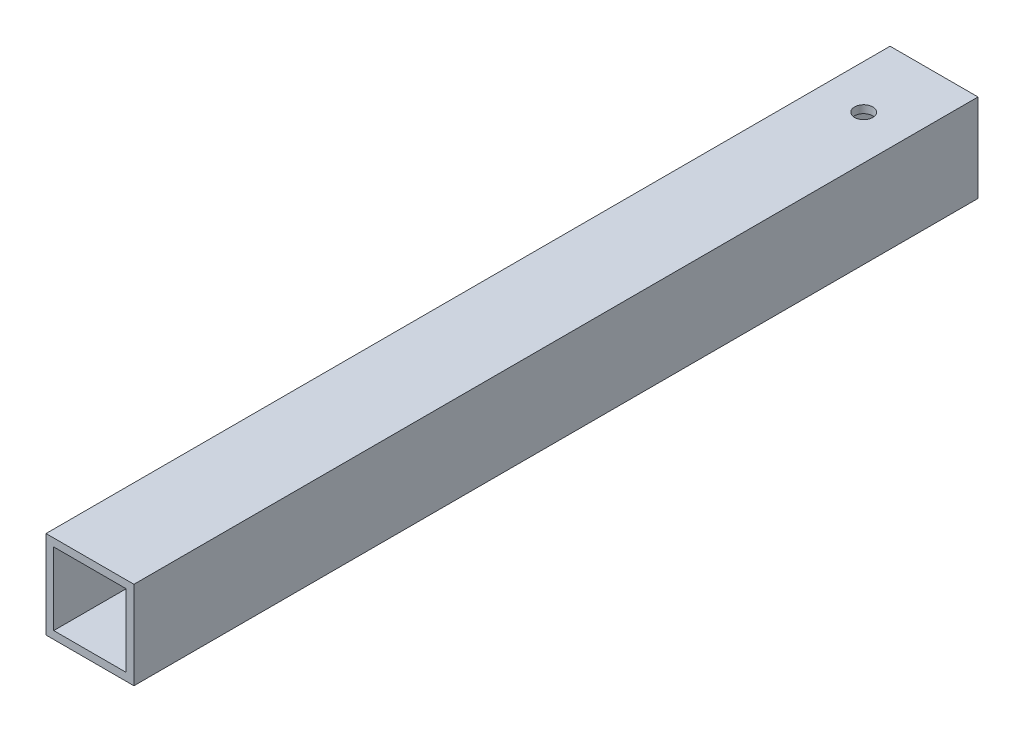
ISO-10303-21;
HEADER;
FILE_DESCRIPTION(('STEP AP214'),'2;1');
FILE_NAME('part.step','',(''),(''),'','','');
FILE_SCHEMA(('AUTOMOTIVE_DESIGN { 1 0 10303 214 1 1 1 1 }'));
ENDSEC;
DATA;
#1=APPLICATION_CONTEXT('core data for automotive mechanical design processes');
#2=APPLICATION_PROTOCOL_DEFINITION('international standard','automotive_design',2000,#1);
#3=PRODUCT_CONTEXT('',#1,'mechanical');
#4=PRODUCT('Part','Part','',(#3));
#5=PRODUCT_RELATED_PRODUCT_CATEGORY('part','',(#4));
#6=PRODUCT_DEFINITION_FORMATION('','',#4);
#7=PRODUCT_DEFINITION_CONTEXT('part definition',#1,'design');
#8=PRODUCT_DEFINITION('design','',#6,#7);
#9=PRODUCT_DEFINITION_SHAPE('','',#8);
#10=(LENGTH_UNIT() NAMED_UNIT(*) SI_UNIT(.MILLI.,.METRE.));
#11=(NAMED_UNIT(*) PLANE_ANGLE_UNIT() SI_UNIT($,.RADIAN.));
#12=(NAMED_UNIT(*) SI_UNIT($,.STERADIAN.) SOLID_ANGLE_UNIT());
#13=UNCERTAINTY_MEASURE_WITH_UNIT(LENGTH_MEASURE(1.E-05),#10,'distance_accuracy_value','');
#14=(GEOMETRIC_REPRESENTATION_CONTEXT(3) GLOBAL_UNCERTAINTY_ASSIGNED_CONTEXT((#13)) GLOBAL_UNIT_ASSIGNED_CONTEXT((#10,
#11,#12)) REPRESENTATION_CONTEXT('',''));
#15=CARTESIAN_POINT('',(0.,0.,0.));
#16=DIRECTION('',(0.,0.,1.));
#17=DIRECTION('',(1.,0.,0.));
#18=AXIS2_PLACEMENT_3D('',#15,#16,#17);
#19=CARTESIAN_POINT('',(0.,0.,304.8));
#20=DIRECTION('',(0.,0.,1.));
#21=DIRECTION('',(1.,0.,0.));
#22=AXIS2_PLACEMENT_3D('',#19,#20,#21);
#23=PLANE('',#22);
#24=DIRECTION('',(0.,-1.,0.));
#25=VECTOR('',#24,1.);
#26=CARTESIAN_POINT('',(-15.875,-15.875,304.8));
#27=LINE('',#26,#25);
#28=CARTESIAN_POINT('',(-15.875,15.875,304.8));
#29=VERTEX_POINT('',#28);
#30=CARTESIAN_POINT('',(-15.875,-15.875,304.8));
#31=VERTEX_POINT('',#30);
#32=EDGE_CURVE('E165',#29,#31,#27,.T.);
#33=ORIENTED_EDGE('',*,*,#32,.T.);
#34=DIRECTION('',(1.,0.,0.));
#35=VECTOR('',#34,1.);
#36=CARTESIAN_POINT('',(15.875,-15.875,304.8));
#37=LINE('',#36,#35);
#38=CARTESIAN_POINT('',(15.875,-15.875,304.8));
#39=VERTEX_POINT('',#38);
#40=EDGE_CURVE('E169',#31,#39,#37,.T.);
#41=ORIENTED_EDGE('',*,*,#40,.T.);
#42=DIRECTION('',(0.,1.,0.));
#43=VECTOR('',#42,1.);
#44=CARTESIAN_POINT('',(15.875,-15.875,304.8));
#45=LINE('',#44,#43);
#46=CARTESIAN_POINT('',(15.875,15.875,304.8));
#47=VERTEX_POINT('',#46);
#48=EDGE_CURVE('E173',#39,#47,#45,.T.);
#49=ORIENTED_EDGE('',*,*,#48,.T.);
#50=DIRECTION('',(-1.,0.,0.));
#51=VECTOR('',#50,1.);
#52=CARTESIAN_POINT('',(15.875,15.875,304.8));
#53=LINE('',#52,#51);
#54=EDGE_CURVE('E176',#47,#29,#53,.T.);
#55=ORIENTED_EDGE('',*,*,#54,.T.);
#56=EDGE_LOOP('',(#33,#41,#49,#55));
#57=FACE_BOUND('',#56,.T.);
#58=DIRECTION('',(-1.,0.,0.));
#59=VECTOR('',#58,1.);
#60=CARTESIAN_POINT('',(13.081,13.081,304.8));
#61=LINE('',#60,#59);
#62=CARTESIAN_POINT('',(13.081,13.081,304.8));
#63=VERTEX_POINT('',#62);
#64=CARTESIAN_POINT('',(-13.081,13.081,304.8));
#65=VERTEX_POINT('',#64);
#66=EDGE_CURVE('E123',#63,#65,#61,.T.);
#67=ORIENTED_EDGE('',*,*,#66,.F.);
#68=DIRECTION('',(0.,1.,0.));
#69=VECTOR('',#68,1.);
#70=CARTESIAN_POINT('',(13.081,-13.081,304.8));
#71=LINE('',#70,#69);
#72=CARTESIAN_POINT('',(13.081,-13.081,304.8));
#73=VERTEX_POINT('',#72);
#74=EDGE_CURVE('E114',#73,#63,#71,.T.);
#75=ORIENTED_EDGE('',*,*,#74,.F.);
#76=DIRECTION('',(1.,0.,0.));
#77=VECTOR('',#76,1.);
#78=CARTESIAN_POINT('',(13.081,-13.081,304.8));
#79=LINE('',#78,#77);
#80=CARTESIAN_POINT('',(-13.081,-13.081,304.8));
#81=VERTEX_POINT('',#80);
#82=EDGE_CURVE('E141',#81,#73,#79,.T.);
#83=ORIENTED_EDGE('',*,*,#82,.F.);
#84=DIRECTION('',(0.,-1.,0.));
#85=VECTOR('',#84,1.);
#86=CARTESIAN_POINT('',(-13.081,-13.081,304.8));
#87=LINE('',#86,#85);
#88=EDGE_CURVE('E136',#65,#81,#87,.T.);
#89=ORIENTED_EDGE('',*,*,#88,.F.);
#90=EDGE_LOOP('',(#67,#75,#83,#89));
#91=FACE_BOUND('',#90,.T.);
#92=ADVANCED_FACE('F47',(#57,#91),#23,.T.);
#93=CARTESIAN_POINT('',(0.,0.,0.));
#94=DIRECTION('',(0.,0.,1.));
#95=DIRECTION('',(1.,0.,0.));
#96=AXIS2_PLACEMENT_3D('',#93,#94,#95);
#97=PLANE('',#96);
#98=DIRECTION('',(0.,-1.,0.));
#99=VECTOR('',#98,1.);
#100=CARTESIAN_POINT('',(-15.875,-15.875,0.));
#101=LINE('',#100,#99);
#102=CARTESIAN_POINT('',(-15.875,15.875,0.));
#103=VERTEX_POINT('',#102);
#104=CARTESIAN_POINT('',(-15.875,-15.875,0.));
#105=VERTEX_POINT('',#104);
#106=EDGE_CURVE('E132',#103,#105,#101,.T.);
#107=ORIENTED_EDGE('',*,*,#106,.F.);
#108=DIRECTION('',(-1.,0.,0.));
#109=VECTOR('',#108,1.);
#110=CARTESIAN_POINT('',(15.875,15.875,0.));
#111=LINE('',#110,#109);
#112=CARTESIAN_POINT('',(15.875,15.875,0.));
#113=VERTEX_POINT('',#112);
#114=EDGE_CURVE('E170',#113,#103,#111,.T.);
#115=ORIENTED_EDGE('',*,*,#114,.F.);
#116=DIRECTION('',(0.,1.,0.));
#117=VECTOR('',#116,1.);
#118=CARTESIAN_POINT('',(15.875,-15.875,0.));
#119=LINE('',#118,#117);
#120=CARTESIAN_POINT('',(15.875,-15.875,0.));
#121=VERTEX_POINT('',#120);
#122=EDGE_CURVE('E186',#121,#113,#119,.T.);
#123=ORIENTED_EDGE('',*,*,#122,.F.);
#124=DIRECTION('',(1.,0.,0.));
#125=VECTOR('',#124,1.);
#126=CARTESIAN_POINT('',(15.875,-15.875,0.));
#127=LINE('',#126,#125);
#128=EDGE_CURVE('E183',#105,#121,#127,.T.);
#129=ORIENTED_EDGE('',*,*,#128,.F.);
#130=EDGE_LOOP('',(#107,#115,#123,#129));
#131=FACE_BOUND('',#130,.T.);
#132=DIRECTION('',(0.,1.,0.));
#133=VECTOR('',#132,1.);
#134=CARTESIAN_POINT('',(13.081,-13.081,0.));
#135=LINE('',#134,#133);
#136=CARTESIAN_POINT('',(13.081,-13.081,0.));
#137=VERTEX_POINT('',#136);
#138=CARTESIAN_POINT('',(13.081,13.081,0.));
#139=VERTEX_POINT('',#138);
#140=EDGE_CURVE('E72',#137,#139,#135,.T.);
#141=ORIENTED_EDGE('',*,*,#140,.T.);
#142=DIRECTION('',(-1.,0.,0.));
#143=VECTOR('',#142,1.);
#144=CARTESIAN_POINT('',(13.081,13.081,0.));
#145=LINE('',#144,#143);
#146=CARTESIAN_POINT('',(-13.081,13.081,0.));
#147=VERTEX_POINT('',#146);
#148=EDGE_CURVE('E130',#139,#147,#145,.T.);
#149=ORIENTED_EDGE('',*,*,#148,.T.);
#150=DIRECTION('',(0.,-1.,0.));
#151=VECTOR('',#150,1.);
#152=CARTESIAN_POINT('',(-13.081,-13.081,0.));
#153=LINE('',#152,#151);
#154=CARTESIAN_POINT('',(-13.081,-13.081,0.));
#155=VERTEX_POINT('',#154);
#156=EDGE_CURVE('E152',#147,#155,#153,.T.);
#157=ORIENTED_EDGE('',*,*,#156,.T.);
#158=DIRECTION('',(1.,0.,0.));
#159=VECTOR('',#158,1.);
#160=CARTESIAN_POINT('',(13.081,-13.081,0.));
#161=LINE('',#160,#159);
#162=EDGE_CURVE('E124',#155,#137,#161,.T.);
#163=ORIENTED_EDGE('',*,*,#162,.T.);
#164=EDGE_LOOP('',(#141,#149,#157,#163));
#165=FACE_BOUND('',#164,.T.);
#166=ADVANCED_FACE('F211',(#131,#165),#97,.F.);
#167=CARTESIAN_POINT('',(-15.875,-15.875,304.8));
#168=DIRECTION('',(1.,0.,0.));
#169=DIRECTION('',(0.,0.,-1.));
#170=AXIS2_PLACEMENT_3D('',#167,#168,#169);
#171=PLANE('',#170);
#172=ORIENTED_EDGE('',*,*,#106,.T.);
#173=DIRECTION('',(0.,0.,-1.));
#174=VECTOR('',#173,1.);
#175=CARTESIAN_POINT('',(-15.875,-15.875,304.8));
#176=LINE('',#175,#174);
#177=EDGE_CURVE('E11',#31,#105,#176,.T.);
#178=ORIENTED_EDGE('',*,*,#177,.F.);
#179=ORIENTED_EDGE('',*,*,#32,.F.);
#180=DIRECTION('',(0.,0.,-1.));
#181=VECTOR('',#180,1.);
#182=CARTESIAN_POINT('',(-15.875,15.875,304.8));
#183=LINE('',#182,#181);
#184=EDGE_CURVE('E179',#29,#103,#183,.T.);
#185=ORIENTED_EDGE('',*,*,#184,.T.);
#186=EDGE_LOOP('',(#172,#178,#179,#185));
#187=FACE_BOUND('',#186,.T.);
#188=ADVANCED_FACE('F49',(#187),#171,.F.);
#189=CARTESIAN_POINT('',(15.875,-15.875,304.8));
#190=DIRECTION('',(0.,1.,0.));
#191=DIRECTION('',(-1.,0.,0.));
#192=AXIS2_PLACEMENT_3D('',#189,#190,#191);
#193=PLANE('',#192);
#194=CARTESIAN_POINT('',(0.,-15.875,25.4));
#195=DIRECTION('',(0.,1.,0.));
#196=DIRECTION('',(-1.,0.,0.));
#197=AXIS2_PLACEMENT_3D('',#194,#195,#196);
#198=CIRCLE('',#197,3.302);
#199=CARTESIAN_POINT('',(-3.302,-15.875,25.4));
#200=VERTEX_POINT('',#199);
#201=EDGE_CURVE('E252',#200,#200,#198,.T.);
#202=ORIENTED_EDGE('',*,*,#201,.T.);
#203=EDGE_LOOP('',(#202));
#204=FACE_BOUND('',#203,.T.);
#205=ORIENTED_EDGE('',*,*,#128,.T.);
#206=DIRECTION('',(0.,0.,-1.));
#207=VECTOR('',#206,1.);
#208=CARTESIAN_POINT('',(15.875,-15.875,304.8));
#209=LINE('',#208,#207);
#210=EDGE_CURVE('E57',#39,#121,#209,.T.);
#211=ORIENTED_EDGE('',*,*,#210,.F.);
#212=ORIENTED_EDGE('',*,*,#40,.F.);
#213=ORIENTED_EDGE('',*,*,#177,.T.);
#214=EDGE_LOOP('',(#205,#211,#212,#213));
#215=FACE_BOUND('',#214,.T.);
#216=ADVANCED_FACE('F221',(#204,#215),#193,.F.);
#217=CARTESIAN_POINT('',(15.875,-15.875,304.8));
#218=DIRECTION('',(-1.,0.,0.));
#219=DIRECTION('',(0.,0.,1.));
#220=AXIS2_PLACEMENT_3D('',#217,#218,#219);
#221=PLANE('',#220);
#222=ORIENTED_EDGE('',*,*,#122,.T.);
#223=DIRECTION('',(0.,0.,-1.));
#224=VECTOR('',#223,1.);
#225=CARTESIAN_POINT('',(15.875,15.875,304.8));
#226=LINE('',#225,#224);
#227=EDGE_CURVE('E194',#47,#113,#226,.T.);
#228=ORIENTED_EDGE('',*,*,#227,.F.);
#229=ORIENTED_EDGE('',*,*,#48,.F.);
#230=ORIENTED_EDGE('',*,*,#210,.T.);
#231=EDGE_LOOP('',(#222,#228,#229,#230));
#232=FACE_BOUND('',#231,.T.);
#233=ADVANCED_FACE('F205',(#232),#221,.F.);
#234=CARTESIAN_POINT('',(15.875,15.875,304.8));
#235=DIRECTION('',(0.,-1.,0.));
#236=DIRECTION('',(1.,0.,0.));
#237=AXIS2_PLACEMENT_3D('',#234,#235,#236);
#238=PLANE('',#237);
#239=CARTESIAN_POINT('',(0.,15.875,25.4));
#240=DIRECTION('',(0.,1.,0.));
#241=DIRECTION('',(-1.,0.,0.));
#242=AXIS2_PLACEMENT_3D('',#239,#240,#241);
#243=CIRCLE('',#242,3.302);
#244=CARTESIAN_POINT('',(-3.302,15.875,25.4));
#245=VERTEX_POINT('',#244);
#246=EDGE_CURVE('E249',#245,#245,#243,.T.);
#247=ORIENTED_EDGE('',*,*,#246,.F.);
#248=EDGE_LOOP('',(#247));
#249=FACE_BOUND('',#248,.T.);
#250=ORIENTED_EDGE('',*,*,#114,.T.);
#251=ORIENTED_EDGE('',*,*,#184,.F.);
#252=ORIENTED_EDGE('',*,*,#54,.F.);
#253=ORIENTED_EDGE('',*,*,#227,.T.);
#254=EDGE_LOOP('',(#250,#251,#252,#253));
#255=FACE_BOUND('',#254,.T.);
#256=ADVANCED_FACE('F215',(#249,#255),#238,.F.);
#257=CARTESIAN_POINT('',(13.081,-13.081,304.8));
#258=DIRECTION('',(-1.,0.,0.));
#259=DIRECTION('',(0.,0.,1.));
#260=AXIS2_PLACEMENT_3D('',#257,#258,#259);
#261=PLANE('',#260);
#262=ORIENTED_EDGE('',*,*,#140,.F.);
#263=DIRECTION('',(0.,0.,-1.));
#264=VECTOR('',#263,1.);
#265=CARTESIAN_POINT('',(13.081,-13.081,304.8));
#266=LINE('',#265,#264);
#267=EDGE_CURVE('E118',#73,#137,#266,.T.);
#268=ORIENTED_EDGE('',*,*,#267,.F.);
#269=ORIENTED_EDGE('',*,*,#74,.T.);
#270=DIRECTION('',(0.,0.,-1.));
#271=VECTOR('',#270,1.);
#272=CARTESIAN_POINT('',(13.081,13.081,304.8));
#273=LINE('',#272,#271);
#274=EDGE_CURVE('E117',#63,#139,#273,.T.);
#275=ORIENTED_EDGE('',*,*,#274,.T.);
#276=EDGE_LOOP('',(#262,#268,#269,#275));
#277=FACE_BOUND('',#276,.T.);
#278=ADVANCED_FACE('F116',(#277),#261,.T.);
#279=CARTESIAN_POINT('',(13.081,13.081,304.8));
#280=DIRECTION('',(0.,-1.,0.));
#281=DIRECTION('',(1.,0.,0.));
#282=AXIS2_PLACEMENT_3D('',#279,#280,#281);
#283=PLANE('',#282);
#284=CARTESIAN_POINT('',(0.,13.081,25.4));
#285=DIRECTION('',(0.,-1.,0.));
#286=DIRECTION('',(1.,0.,0.));
#287=AXIS2_PLACEMENT_3D('',#284,#285,#286);
#288=CIRCLE('',#287,3.302);
#289=CARTESIAN_POINT('',(3.302,13.081,25.4));
#290=VERTEX_POINT('',#289);
#291=EDGE_CURVE('E149',#290,#290,#288,.T.);
#292=ORIENTED_EDGE('',*,*,#291,.F.);
#293=EDGE_LOOP('',(#292));
#294=FACE_BOUND('',#293,.T.);
#295=ORIENTED_EDGE('',*,*,#148,.F.);
#296=ORIENTED_EDGE('',*,*,#274,.F.);
#297=ORIENTED_EDGE('',*,*,#66,.T.);
#298=DIRECTION('',(0.,0.,-1.));
#299=VECTOR('',#298,1.);
#300=CARTESIAN_POINT('',(-13.081,13.081,304.8));
#301=LINE('',#300,#299);
#302=EDGE_CURVE('E133',#65,#147,#301,.T.);
#303=ORIENTED_EDGE('',*,*,#302,.T.);
#304=EDGE_LOOP('',(#295,#296,#297,#303));
#305=FACE_BOUND('',#304,.T.);
#306=ADVANCED_FACE('F127',(#294,#305),#283,.T.);
#307=CARTESIAN_POINT('',(-13.081,-13.081,304.8));
#308=DIRECTION('',(1.,0.,0.));
#309=DIRECTION('',(0.,1.,0.));
#310=AXIS2_PLACEMENT_3D('',#307,#308,#309);
#311=PLANE('',#310);
#312=ORIENTED_EDGE('',*,*,#156,.F.);
#313=ORIENTED_EDGE('',*,*,#302,.F.);
#314=ORIENTED_EDGE('',*,*,#88,.T.);
#315=DIRECTION('',(0.,0.,-1.));
#316=VECTOR('',#315,1.);
#317=CARTESIAN_POINT('',(-13.081,-13.081,304.8));
#318=LINE('',#317,#316);
#319=EDGE_CURVE('E64',#81,#155,#318,.T.);
#320=ORIENTED_EDGE('',*,*,#319,.T.);
#321=EDGE_LOOP('',(#312,#313,#314,#320));
#322=FACE_BOUND('',#321,.T.);
#323=ADVANCED_FACE('F272',(#322),#311,.T.);
#324=CARTESIAN_POINT('',(13.081,-13.081,304.8));
#325=DIRECTION('',(0.,1.,0.));
#326=DIRECTION('',(0.,0.,1.));
#327=AXIS2_PLACEMENT_3D('',#324,#325,#326);
#328=PLANE('',#327);
#329=CARTESIAN_POINT('',(0.,-13.081,25.4));
#330=DIRECTION('',(0.,1.,0.));
#331=DIRECTION('',(0.,0.,1.));
#332=AXIS2_PLACEMENT_3D('',#329,#330,#331);
#333=CIRCLE('',#332,3.302);
#334=CARTESIAN_POINT('',(0.,-13.081,28.702));
#335=VERTEX_POINT('',#334);
#336=EDGE_CURVE('E51',#335,#335,#333,.T.);
#337=ORIENTED_EDGE('',*,*,#336,.F.);
#338=EDGE_LOOP('',(#337));
#339=FACE_BOUND('',#338,.T.);
#340=ORIENTED_EDGE('',*,*,#162,.F.);
#341=ORIENTED_EDGE('',*,*,#319,.F.);
#342=ORIENTED_EDGE('',*,*,#82,.T.);
#343=ORIENTED_EDGE('',*,*,#267,.T.);
#344=EDGE_LOOP('',(#340,#341,#342,#343));
#345=FACE_BOUND('',#344,.T.);
#346=ADVANCED_FACE('F270',(#339,#345),#328,.T.);
#347=CARTESIAN_POINT('',(0.,-15.875,25.4));
#348=DIRECTION('',(0.,1.,0.));
#349=DIRECTION('',(-1.,0.,0.));
#350=AXIS2_PLACEMENT_3D('',#347,#348,#349);
#351=CYLINDRICAL_SURFACE('',#350,3.302);
#352=ORIENTED_EDGE('',*,*,#336,.T.);
#353=EDGE_LOOP('',(#352));
#354=FACE_BOUND('',#353,.T.);
#355=ORIENTED_EDGE('',*,*,#201,.F.);
#356=EDGE_LOOP('',(#355));
#357=FACE_BOUND('',#356,.T.);
#358=ADVANCED_FACE('F267',(#354,#357),#351,.F.);
#359=ORIENTED_EDGE('',*,*,#291,.T.);
#360=EDGE_LOOP('',(#359));
#361=FACE_BOUND('',#360,.T.);
#362=ORIENTED_EDGE('',*,*,#246,.T.);
#363=EDGE_LOOP('',(#362));
#364=FACE_BOUND('',#363,.T.);
#365=ADVANCED_FACE('F285',(#361,#364),#351,.F.);
#366=CLOSED_SHELL('',(#92,#166,#188,#216,#233,#256,#278,#306,#323,#346,#358,#365));
#367=MANIFOLD_SOLID_BREP('B2',#366);
#368=ADVANCED_BREP_SHAPE_REPRESENTATION('',(#18,#367),#14);
#369=SHAPE_DEFINITION_REPRESENTATION(#9,#368);
ENDSEC;
END-ISO-10303-21;
